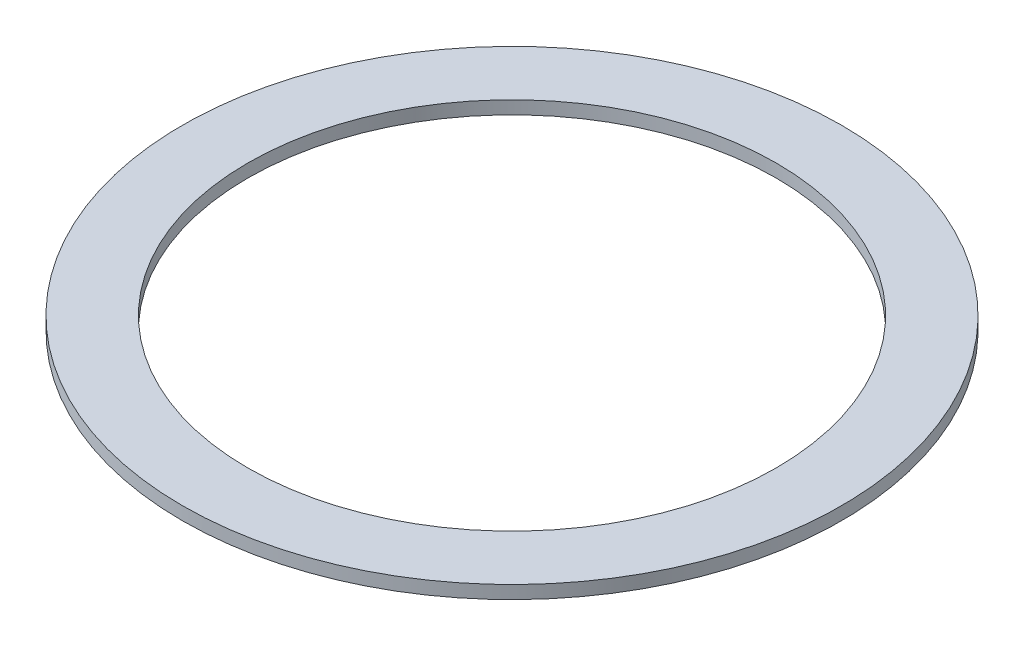
ISO-10303-21;
HEADER;
FILE_DESCRIPTION(('STEP AP214'),'2;1');
FILE_NAME('part.step','',(''),(''),'','','');
FILE_SCHEMA(('AUTOMOTIVE_DESIGN { 1 0 10303 214 1 1 1 1 }'));
ENDSEC;
DATA;
#1=APPLICATION_CONTEXT('core data for automotive mechanical design processes');
#2=APPLICATION_PROTOCOL_DEFINITION('international standard','automotive_design',2000,#1);
#3=PRODUCT_CONTEXT('',#1,'mechanical');
#4=PRODUCT('Part','Part','',(#3));
#5=PRODUCT_RELATED_PRODUCT_CATEGORY('part','',(#4));
#6=PRODUCT_DEFINITION_FORMATION('','',#4);
#7=PRODUCT_DEFINITION_CONTEXT('part definition',#1,'design');
#8=PRODUCT_DEFINITION('design','',#6,#7);
#9=PRODUCT_DEFINITION_SHAPE('','',#8);
#10=(LENGTH_UNIT() NAMED_UNIT(*) SI_UNIT(.MILLI.,.METRE.));
#11=(NAMED_UNIT(*) PLANE_ANGLE_UNIT() SI_UNIT($,.RADIAN.));
#12=(NAMED_UNIT(*) SI_UNIT($,.STERADIAN.) SOLID_ANGLE_UNIT());
#13=UNCERTAINTY_MEASURE_WITH_UNIT(LENGTH_MEASURE(1.E-05),#10,'distance_accuracy_value','');
#14=(GEOMETRIC_REPRESENTATION_CONTEXT(3) GLOBAL_UNCERTAINTY_ASSIGNED_CONTEXT((#13)) GLOBAL_UNIT_ASSIGNED_CONTEXT((#10,
#11,#12)) REPRESENTATION_CONTEXT('',''));
#15=CARTESIAN_POINT('',(0.,0.,0.));
#16=DIRECTION('',(0.,0.,1.));
#17=DIRECTION('',(1.,0.,0.));
#18=AXIS2_PLACEMENT_3D('',#15,#16,#17);
#19=CARTESIAN_POINT('',(0.,2.,0.));
#20=DIRECTION('',(0.,1.,0.));
#21=DIRECTION('',(0.,0.,1.));
#22=AXIS2_PLACEMENT_3D('',#19,#20,#21);
#23=PLANE('',#22);
#24=CARTESIAN_POINT('',(0.,2.,0.));
#25=DIRECTION('',(0.,1.,0.));
#26=DIRECTION('',(0.,0.,1.));
#27=AXIS2_PLACEMENT_3D('',#24,#25,#26);
#28=CIRCLE('',#27,50.4);
#29=CARTESIAN_POINT('',(0.,2.,50.4));
#30=VERTEX_POINT('',#29);
#31=EDGE_CURVE('E10',#30,#30,#28,.T.);
#32=ORIENTED_EDGE('',*,*,#31,.T.);
#33=EDGE_LOOP('',(#32));
#34=FACE_BOUND('',#33,.T.);
#35=CARTESIAN_POINT('',(0.,2.,0.));
#36=DIRECTION('',(0.,1.,0.));
#37=DIRECTION('',(0.,0.,1.));
#38=AXIS2_PLACEMENT_3D('',#35,#36,#37);
#39=CIRCLE('',#38,40.4);
#40=CARTESIAN_POINT('',(0.,2.,40.4));
#41=VERTEX_POINT('',#40);
#42=EDGE_CURVE('E43',#41,#41,#39,.T.);
#43=ORIENTED_EDGE('',*,*,#42,.F.);
#44=EDGE_LOOP('',(#43));
#45=FACE_BOUND('',#44,.T.);
#46=ADVANCED_FACE('F32',(#34,#45),#23,.T.);
#47=CARTESIAN_POINT('',(0.,0.,0.));
#48=DIRECTION('',(0.,1.,0.));
#49=DIRECTION('',(0.,0.,1.));
#50=AXIS2_PLACEMENT_3D('',#47,#48,#49);
#51=PLANE('',#50);
#52=CARTESIAN_POINT('',(0.,0.,0.));
#53=DIRECTION('',(0.,1.,0.));
#54=DIRECTION('',(0.,0.,1.));
#55=AXIS2_PLACEMENT_3D('',#52,#53,#54);
#56=CIRCLE('',#55,50.4);
#57=CARTESIAN_POINT('',(0.,0.,50.4));
#58=VERTEX_POINT('',#57);
#59=EDGE_CURVE('E36',#58,#58,#56,.T.);
#60=ORIENTED_EDGE('',*,*,#59,.F.);
#61=EDGE_LOOP('',(#60));
#62=FACE_BOUND('',#61,.T.);
#63=CARTESIAN_POINT('',(0.,0.,0.));
#64=DIRECTION('',(0.,1.,0.));
#65=DIRECTION('',(0.,0.,1.));
#66=AXIS2_PLACEMENT_3D('',#63,#64,#65);
#67=CIRCLE('',#66,40.4);
#68=CARTESIAN_POINT('',(0.,0.,40.4));
#69=VERTEX_POINT('',#68);
#70=EDGE_CURVE('E45',#69,#69,#67,.T.);
#71=ORIENTED_EDGE('',*,*,#70,.T.);
#72=EDGE_LOOP('',(#71));
#73=FACE_BOUND('',#72,.T.);
#74=ADVANCED_FACE('F55',(#62,#73),#51,.F.);
#75=CARTESIAN_POINT('',(0.,2.,0.));
#76=DIRECTION('',(0.,-1.,0.));
#77=DIRECTION('',(0.,0.,-1.));
#78=AXIS2_PLACEMENT_3D('',#75,#76,#77);
#79=CYLINDRICAL_SURFACE('',#78,50.4);
#80=ORIENTED_EDGE('',*,*,#31,.F.);
#81=EDGE_LOOP('',(#80));
#82=FACE_BOUND('',#81,.T.);
#83=ORIENTED_EDGE('',*,*,#59,.T.);
#84=EDGE_LOOP('',(#83));
#85=FACE_BOUND('',#84,.T.);
#86=ADVANCED_FACE('F34',(#82,#85),#79,.T.);
#87=CARTESIAN_POINT('',(0.,2.,0.));
#88=DIRECTION('',(0.,-1.,0.));
#89=DIRECTION('',(0.,0.,-1.));
#90=AXIS2_PLACEMENT_3D('',#87,#88,#89);
#91=CYLINDRICAL_SURFACE('',#90,40.4);
#92=ORIENTED_EDGE('',*,*,#42,.T.);
#93=EDGE_LOOP('',(#92));
#94=FACE_BOUND('',#93,.T.);
#95=ORIENTED_EDGE('',*,*,#70,.F.);
#96=EDGE_LOOP('',(#95));
#97=FACE_BOUND('',#96,.T.);
#98=ADVANCED_FACE('F51',(#94,#97),#91,.F.);
#99=CLOSED_SHELL('',(#46,#74,#86,#98));
#100=MANIFOLD_SOLID_BREP('B2',#99);
#101=ADVANCED_BREP_SHAPE_REPRESENTATION('',(#18,#100),#14);
#102=SHAPE_DEFINITION_REPRESENTATION(#9,#101);
ENDSEC;
END-ISO-10303-21;
